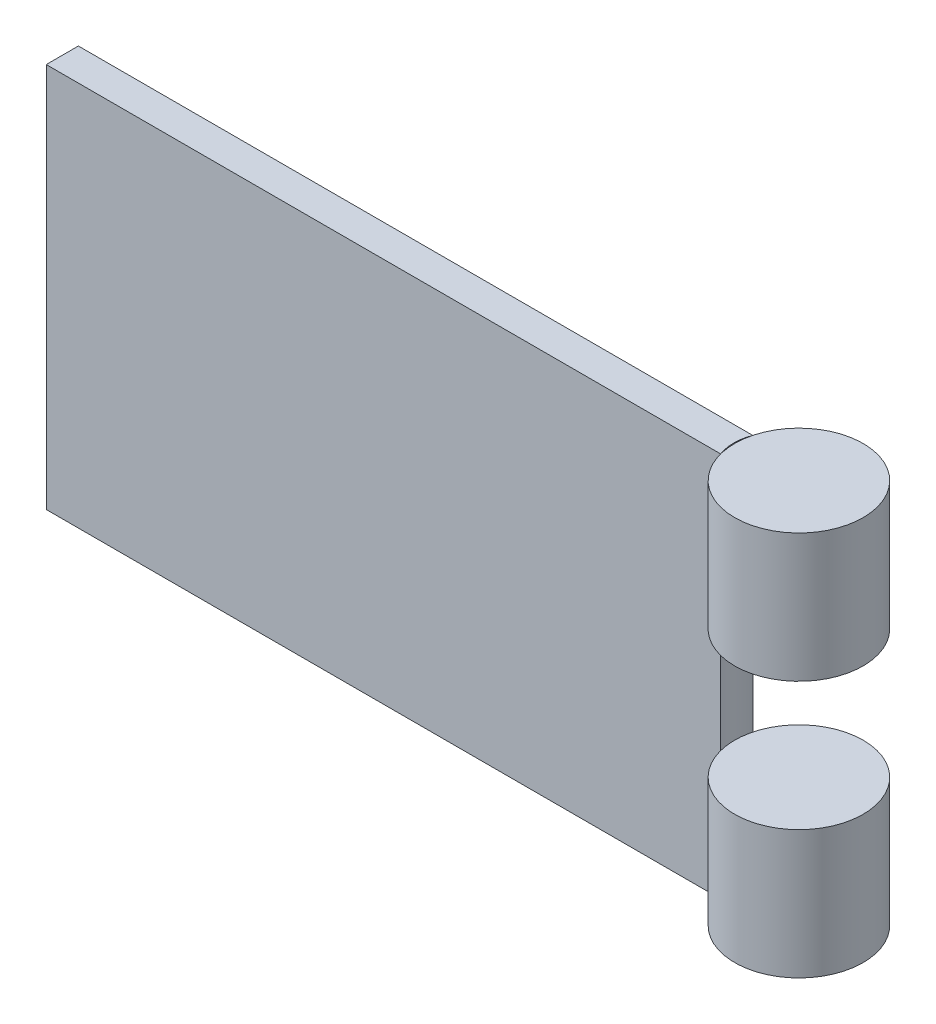
ISO-10303-21;
HEADER;
FILE_DESCRIPTION(('STEP AP214'),'2;1');
FILE_NAME('part.step','',(''),(''),'','','');
FILE_SCHEMA(('AUTOMOTIVE_DESIGN { 1 0 10303 214 1 1 1 1 }'));
ENDSEC;
DATA;
#1=APPLICATION_CONTEXT('core data for automotive mechanical design processes');
#2=APPLICATION_PROTOCOL_DEFINITION('international standard','automotive_design',2000,#1);
#3=PRODUCT_CONTEXT('',#1,'mechanical');
#4=PRODUCT('Part','Part','',(#3));
#5=PRODUCT_RELATED_PRODUCT_CATEGORY('part','',(#4));
#6=PRODUCT_DEFINITION_FORMATION('','',#4);
#7=PRODUCT_DEFINITION_CONTEXT('part definition',#1,'design');
#8=PRODUCT_DEFINITION('design','',#6,#7);
#9=PRODUCT_DEFINITION_SHAPE('','',#8);
#10=(LENGTH_UNIT() NAMED_UNIT(*) SI_UNIT(.MILLI.,.METRE.));
#11=(NAMED_UNIT(*) PLANE_ANGLE_UNIT() SI_UNIT($,.RADIAN.));
#12=(NAMED_UNIT(*) SI_UNIT($,.STERADIAN.) SOLID_ANGLE_UNIT());
#13=UNCERTAINTY_MEASURE_WITH_UNIT(LENGTH_MEASURE(1.E-05),#10,'distance_accuracy_value','');
#14=(GEOMETRIC_REPRESENTATION_CONTEXT(3) GLOBAL_UNCERTAINTY_ASSIGNED_CONTEXT((#13)) GLOBAL_UNIT_ASSIGNED_CONTEXT((#10,
#11,#12)) REPRESENTATION_CONTEXT('',''));
#15=CARTESIAN_POINT('',(0.,0.,0.));
#16=DIRECTION('',(0.,0.,1.));
#17=DIRECTION('',(1.,0.,0.));
#18=AXIS2_PLACEMENT_3D('',#15,#16,#17);
#19=CARTESIAN_POINT('',(-7.09333995380922,-69.1347899159664,2.5));
#20=DIRECTION('',(0.,-1.,0.));
#21=DIRECTION('',(0.,0.,-1.));
#22=AXIS2_PLACEMENT_3D('',#19,#20,#21);
#23=CYLINDRICAL_SURFACE('',#22,10.);
#24=CARTESIAN_POINT('',(-7.09333995380922,-69.1347899159664,2.5));
#25=DIRECTION('',(0.,-1.,0.));
#26=DIRECTION('',(0.,0.,-1.));
#27=AXIS2_PLACEMENT_3D('',#24,#25,#26);
#28=CIRCLE('',#27,10.);
#29=CARTESIAN_POINT('',(-7.09333995380922,-69.1347899159664,-7.5));
#30=VERTEX_POINT('',#29);
#31=EDGE_CURVE('E11',#30,#30,#28,.T.);
#32=ORIENTED_EDGE('',*,*,#31,.T.);
#33=EDGE_LOOP('',(#32));
#34=FACE_BOUND('',#33,.T.);
#35=CARTESIAN_POINT('',(-7.09333995380922,-89.1347899159664,2.5));
#36=DIRECTION('',(0.,-1.,0.));
#37=DIRECTION('',(0.,0.,-1.));
#38=AXIS2_PLACEMENT_3D('',#35,#36,#37);
#39=CIRCLE('',#38,10.);
#40=CARTESIAN_POINT('',(-7.09333995380922,-89.1347899159664,-7.5));
#41=VERTEX_POINT('',#40);
#42=EDGE_CURVE('E50',#41,#41,#39,.T.);
#43=ORIENTED_EDGE('',*,*,#42,.F.);
#44=EDGE_LOOP('',(#43));
#45=FACE_BOUND('',#44,.T.);
#46=ADVANCED_FACE('F47',(#34,#45),#23,.T.);
#47=CARTESIAN_POINT('',(-7.09333995380922,-69.1347899159664,2.5));
#48=DIRECTION('',(0.,-1.,0.));
#49=DIRECTION('',(0.,0.,-1.));
#50=AXIS2_PLACEMENT_3D('',#47,#48,#49);
#51=PLANE('',#50);
#52=ORIENTED_EDGE('',*,*,#31,.F.);
#53=EDGE_LOOP('',(#52));
#54=FACE_BOUND('',#53,.T.);
#55=ADVANCED_FACE('F62',(#54),#51,.F.);
#56=CARTESIAN_POINT('',(-7.09333995380922,-89.1347899159664,2.5));
#57=DIRECTION('',(0.,-1.,0.));
#58=DIRECTION('',(0.,0.,-1.));
#59=AXIS2_PLACEMENT_3D('',#56,#57,#58);
#60=PLANE('',#59);
#61=ORIENTED_EDGE('',*,*,#42,.T.);
#62=EDGE_LOOP('',(#61));
#63=FACE_BOUND('',#62,.T.);
#64=ADVANCED_FACE('F59',(#63),#60,.T.);
#65=CLOSED_SHELL('',(#46,#55,#64));
#66=MANIFOLD_SOLID_BREP('B2_NOT_SHOWN',#65);
#67=CARTESIAN_POINT('',(-7.09333995380922,-49.1347899159664,2.5));
#68=DIRECTION('',(0.,1.,0.));
#69=DIRECTION('',(0.,0.,1.));
#70=AXIS2_PLACEMENT_3D('',#67,#68,#69);
#71=CYLINDRICAL_SURFACE('',#70,10.);
#72=CARTESIAN_POINT('',(-7.09333995380922,-49.1347899159664,2.5));
#73=DIRECTION('',(0.,1.,0.));
#74=DIRECTION('',(0.,0.,1.));
#75=AXIS2_PLACEMENT_3D('',#72,#73,#74);
#76=CIRCLE('',#75,10.);
#77=CARTESIAN_POINT('',(-7.09333995380922,-49.1347899159664,12.5));
#78=VERTEX_POINT('',#77);
#79=EDGE_CURVE('E46',#78,#78,#76,.T.);
#80=ORIENTED_EDGE('',*,*,#79,.T.);
#81=EDGE_LOOP('',(#80));
#82=FACE_BOUND('',#81,.T.);
#83=CARTESIAN_POINT('',(-7.09333995380922,-29.1347899159664,2.5));
#84=DIRECTION('',(0.,1.,0.));
#85=DIRECTION('',(0.,0.,1.));
#86=AXIS2_PLACEMENT_3D('',#83,#84,#85);
#87=CIRCLE('',#86,10.);
#88=CARTESIAN_POINT('',(-7.09333995380922,-29.1347899159664,12.5));
#89=VERTEX_POINT('',#88);
#90=EDGE_CURVE('E99',#89,#89,#87,.T.);
#91=ORIENTED_EDGE('',*,*,#90,.F.);
#92=EDGE_LOOP('',(#91));
#93=FACE_BOUND('',#92,.T.);
#94=ADVANCED_FACE('F96',(#82,#93),#71,.T.);
#95=CARTESIAN_POINT('',(-7.09333995380922,-49.1347899159664,2.5));
#96=DIRECTION('',(0.,1.,0.));
#97=DIRECTION('',(0.,0.,1.));
#98=AXIS2_PLACEMENT_3D('',#95,#96,#97);
#99=PLANE('',#98);
#100=ORIENTED_EDGE('',*,*,#79,.F.);
#101=EDGE_LOOP('',(#100));
#102=FACE_BOUND('',#101,.T.);
#103=ADVANCED_FACE('F111',(#102),#99,.F.);
#104=CARTESIAN_POINT('',(-7.09333995380922,-29.1347899159664,2.5));
#105=DIRECTION('',(0.,1.,0.));
#106=DIRECTION('',(0.,0.,1.));
#107=AXIS2_PLACEMENT_3D('',#104,#105,#106);
#108=PLANE('',#107);
#109=ORIENTED_EDGE('',*,*,#90,.T.);
#110=EDGE_LOOP('',(#109));
#111=FACE_BOUND('',#110,.T.);
#112=ADVANCED_FACE('F108',(#111),#108,.T.);
#113=CLOSED_SHELL('',(#94,#103,#112));
#114=MANIFOLD_SOLID_BREP('B6_NOT_SHOWN',#113);
#115=CARTESIAN_POINT('',(-136.775798319328,-89.1347899159664,5.));
#116=DIRECTION('',(0.,1.,0.));
#117=DIRECTION('',(0.,0.,1.));
#118=AXIS2_PLACEMENT_3D('',#115,#116,#117);
#119=PLANE('',#118);
#120=DIRECTION('',(1.,0.,0.));
#121=VECTOR('',#120,1.);
#122=CARTESIAN_POINT('',(-136.775798319328,-89.1347899159664,5.));
#123=LINE('',#122,#121);
#124=CARTESIAN_POINT('',(-121.775798319328,-89.1347899159664,5.));
#125=VERTEX_POINT('',#124);
#126=CARTESIAN_POINT('',(-16.7757983193278,-89.1347899159664,5.));
#127=VERTEX_POINT('',#126);
#128=EDGE_CURVE('E193',#125,#127,#123,.T.);
#129=ORIENTED_EDGE('',*,*,#128,.F.);
#130=DIRECTION('',(0.,0.,-1.));
#131=VECTOR('',#130,1.);
#132=CARTESIAN_POINT('',(-121.775798319328,-89.1347899159664,10.));
#133=LINE('',#132,#131);
#134=CARTESIAN_POINT('',(-121.775798319328,-89.1347899159664,0.));
#135=VERTEX_POINT('',#134);
#136=EDGE_CURVE('E187',#125,#135,#133,.T.);
#137=ORIENTED_EDGE('',*,*,#136,.T.);
#138=DIRECTION('',(1.,0.,0.));
#139=VECTOR('',#138,1.);
#140=CARTESIAN_POINT('',(-136.775798319328,-89.1347899159664,0.));
#141=LINE('',#140,#139);
#142=CARTESIAN_POINT('',(-16.7757983193278,-89.1347899159664,0.));
#143=VERTEX_POINT('',#142);
#144=EDGE_CURVE('E170',#135,#143,#141,.T.);
#145=ORIENTED_EDGE('',*,*,#144,.T.);
#146=CARTESIAN_POINT('',(-10.2374499040168,-89.1347899159664,2.5));
#147=DIRECTION('',(0.,-1.,0.));
#148=DIRECTION('',(0.,0.,-1.));
#149=AXIS2_PLACEMENT_3D('',#146,#147,#148);
#150=CIRCLE('',#149,7.);
#151=EDGE_CURVE('E197',#127,#143,#150,.T.);
#152=ORIENTED_EDGE('',*,*,#151,.F.);
#153=EDGE_LOOP('',(#129,#137,#145,#152));
#154=FACE_BOUND('',#153,.T.);
#155=ADVANCED_FACE('F136',(#154),#119,.F.);
#156=CARTESIAN_POINT('',(-136.775798319328,-29.1347899159664,5.));
#157=DIRECTION('',(0.,-1.,0.));
#158=DIRECTION('',(0.,0.,-1.));
#159=AXIS2_PLACEMENT_3D('',#156,#157,#158);
#160=PLANE('',#159);
#161=DIRECTION('',(-1.,0.,0.));
#162=VECTOR('',#161,1.);
#163=CARTESIAN_POINT('',(-136.775798319328,-29.1347899159664,0.));
#164=LINE('',#163,#162);
#165=CARTESIAN_POINT('',(-16.7757983193278,-29.1347899159664,0.));
#166=VERTEX_POINT('',#165);
#167=CARTESIAN_POINT('',(-121.775798319328,-29.1347899159664,0.));
#168=VERTEX_POINT('',#167);
#169=EDGE_CURVE('E139',#166,#168,#164,.T.);
#170=ORIENTED_EDGE('',*,*,#169,.T.);
#171=DIRECTION('',(0.,0.,-1.));
#172=VECTOR('',#171,1.);
#173=CARTESIAN_POINT('',(-121.775798319328,-29.1347899159664,10.));
#174=LINE('',#173,#172);
#175=CARTESIAN_POINT('',(-121.775798319328,-29.1347899159664,5.));
#176=VERTEX_POINT('',#175);
#177=EDGE_CURVE('E152',#176,#168,#174,.T.);
#178=ORIENTED_EDGE('',*,*,#177,.F.);
#179=DIRECTION('',(-1.,0.,0.));
#180=VECTOR('',#179,1.);
#181=CARTESIAN_POINT('',(-136.775798319328,-29.1347899159664,5.));
#182=LINE('',#181,#180);
#183=CARTESIAN_POINT('',(-16.7757983193278,-29.1347899159664,5.));
#184=VERTEX_POINT('',#183);
#185=EDGE_CURVE('E94',#184,#176,#182,.T.);
#186=ORIENTED_EDGE('',*,*,#185,.F.);
#187=CARTESIAN_POINT('',(-10.2374499040168,-29.1347899159664,2.5));
#188=DIRECTION('',(0.,-1.,0.));
#189=DIRECTION('',(0.,0.,-1.));
#190=AXIS2_PLACEMENT_3D('',#187,#188,#189);
#191=CIRCLE('',#190,7.);
#192=EDGE_CURVE('E199',#184,#166,#191,.T.);
#193=ORIENTED_EDGE('',*,*,#192,.T.);
#194=EDGE_LOOP('',(#170,#178,#186,#193));
#195=FACE_BOUND('',#194,.T.);
#196=ADVANCED_FACE('F208',(#195),#160,.F.);
#197=CARTESIAN_POINT('',(0.,0.,5.));
#198=DIRECTION('',(0.,0.,1.));
#199=DIRECTION('',(1.,0.,0.));
#200=AXIS2_PLACEMENT_3D('',#197,#198,#199);
#201=PLANE('',#200);
#202=DIRECTION('',(0.,1.,0.));
#203=VECTOR('',#202,1.);
#204=CARTESIAN_POINT('',(-121.775798319328,0.,5.));
#205=LINE('',#204,#203);
#206=EDGE_CURVE('E194',#125,#176,#205,.T.);
#207=ORIENTED_EDGE('',*,*,#206,.F.);
#208=ORIENTED_EDGE('',*,*,#128,.T.);
#209=DIRECTION('',(0.,1.,0.));
#210=VECTOR('',#209,1.);
#211=CARTESIAN_POINT('',(-16.7757983193278,-29.1347899159664,5.));
#212=LINE('',#211,#210);
#213=EDGE_CURVE('E144',#127,#184,#212,.T.);
#214=ORIENTED_EDGE('',*,*,#213,.T.);
#215=ORIENTED_EDGE('',*,*,#185,.T.);
#216=EDGE_LOOP('',(#207,#208,#214,#215));
#217=FACE_BOUND('',#216,.T.);
#218=ADVANCED_FACE('F209',(#217),#201,.T.);
#219=CARTESIAN_POINT('',(0.,0.,0.));
#220=DIRECTION('',(0.,0.,1.));
#221=DIRECTION('',(1.,0.,0.));
#222=AXIS2_PLACEMENT_3D('',#219,#220,#221);
#223=PLANE('',#222);
#224=ORIENTED_EDGE('',*,*,#144,.F.);
#225=DIRECTION('',(0.,-1.,0.));
#226=VECTOR('',#225,1.);
#227=CARTESIAN_POINT('',(-121.775798319328,-29.1347899159664,0.));
#228=LINE('',#227,#226);
#229=EDGE_CURVE('E185',#168,#135,#228,.T.);
#230=ORIENTED_EDGE('',*,*,#229,.F.);
#231=ORIENTED_EDGE('',*,*,#169,.F.);
#232=DIRECTION('',(0.,1.,0.));
#233=VECTOR('',#232,1.);
#234=CARTESIAN_POINT('',(-16.7757983193278,-29.1347899159664,0.));
#235=LINE('',#234,#233);
#236=EDGE_CURVE('E177',#143,#166,#235,.T.);
#237=ORIENTED_EDGE('',*,*,#236,.F.);
#238=EDGE_LOOP('',(#224,#230,#231,#237));
#239=FACE_BOUND('',#238,.T.);
#240=ADVANCED_FACE('F196',(#239),#223,.F.);
#241=CARTESIAN_POINT('',(-10.2374499040168,213.686729860253,2.5));
#242=DIRECTION('',(0.,-1.,0.));
#243=DIRECTION('',(0.,0.,-1.));
#244=AXIS2_PLACEMENT_3D('',#241,#242,#243);
#245=CYLINDRICAL_SURFACE('',#244,7.);
#246=ORIENTED_EDGE('',*,*,#192,.F.);
#247=ORIENTED_EDGE('',*,*,#213,.F.);
#248=ORIENTED_EDGE('',*,*,#151,.T.);
#249=ORIENTED_EDGE('',*,*,#236,.T.);
#250=EDGE_LOOP('',(#246,#247,#248,#249));
#251=FACE_BOUND('',#250,.T.);
#252=ADVANCED_FACE('F216',(#251),#245,.F.);
#253=CARTESIAN_POINT('',(-121.775798319328,-29.1347899159664,10.));
#254=DIRECTION('',(1.,0.,0.));
#255=DIRECTION('',(0.,1.,0.));
#256=AXIS2_PLACEMENT_3D('',#253,#254,#255);
#257=PLANE('',#256);
#258=ORIENTED_EDGE('',*,*,#206,.T.);
#259=ORIENTED_EDGE('',*,*,#177,.T.);
#260=ORIENTED_EDGE('',*,*,#229,.T.);
#261=ORIENTED_EDGE('',*,*,#136,.F.);
#262=EDGE_LOOP('',(#258,#259,#260,#261));
#263=FACE_BOUND('',#262,.T.);
#264=ADVANCED_FACE('F186',(#263),#257,.F.);
#265=CLOSED_SHELL('',(#155,#196,#218,#240,#252,#264));
#266=MANIFOLD_SOLID_BREP('B41',#265);
#267=ADVANCED_BREP_SHAPE_REPRESENTATION('',(#18,#66,#114,#266),#14);
#268=SHAPE_DEFINITION_REPRESENTATION(#9,#267);
ENDSEC;
END-ISO-10303-21;
